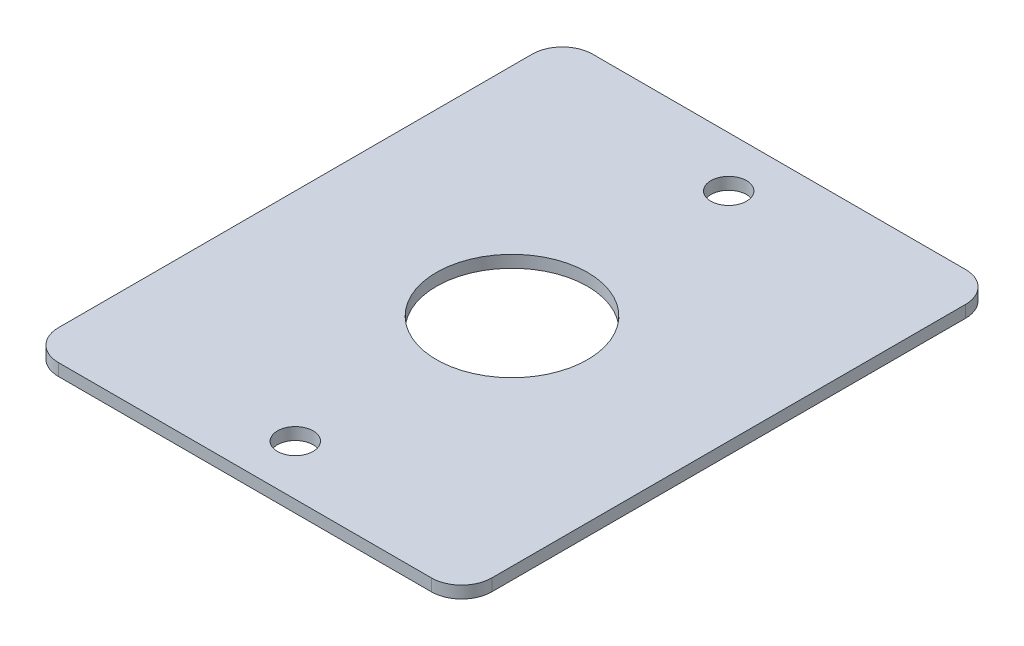
ISO-10303-21;
HEADER;
FILE_DESCRIPTION(('STEP AP214'),'2;1');
FILE_NAME('part.step','',(''),(''),'','','');
FILE_SCHEMA(('AUTOMOTIVE_DESIGN { 1 0 10303 214 1 1 1 1 }'));
ENDSEC;
DATA;
#1=APPLICATION_CONTEXT('core data for automotive mechanical design processes');
#2=APPLICATION_PROTOCOL_DEFINITION('international standard','automotive_design',2000,#1);
#3=PRODUCT_CONTEXT('',#1,'mechanical');
#4=PRODUCT('Part','Part','',(#3));
#5=PRODUCT_RELATED_PRODUCT_CATEGORY('part','',(#4));
#6=PRODUCT_DEFINITION_FORMATION('','',#4);
#7=PRODUCT_DEFINITION_CONTEXT('part definition',#1,'design');
#8=PRODUCT_DEFINITION('design','',#6,#7);
#9=PRODUCT_DEFINITION_SHAPE('','',#8);
#10=(LENGTH_UNIT() NAMED_UNIT(*) SI_UNIT(.MILLI.,.METRE.));
#11=(NAMED_UNIT(*) PLANE_ANGLE_UNIT() SI_UNIT($,.RADIAN.));
#12=(NAMED_UNIT(*) SI_UNIT($,.STERADIAN.) SOLID_ANGLE_UNIT());
#13=UNCERTAINTY_MEASURE_WITH_UNIT(LENGTH_MEASURE(1.E-05),#10,'distance_accuracy_value','');
#14=(GEOMETRIC_REPRESENTATION_CONTEXT(3) GLOBAL_UNCERTAINTY_ASSIGNED_CONTEXT((#13)) GLOBAL_UNIT_ASSIGNED_CONTEXT((#10,
#11,#12)) REPRESENTATION_CONTEXT('',''));
#15=CARTESIAN_POINT('',(0.,0.,0.));
#16=DIRECTION('',(0.,0.,1.));
#17=DIRECTION('',(1.,0.,0.));
#18=AXIS2_PLACEMENT_3D('',#15,#16,#17);
#19=CARTESIAN_POINT('',(0.,1.524,0.));
#20=DIRECTION('',(0.,-1.,0.));
#21=DIRECTION('',(0.,0.,-1.));
#22=AXIS2_PLACEMENT_3D('',#19,#20,#21);
#23=PLANE('',#22);
#24=DIRECTION('',(0.,0.,-1.));
#25=VECTOR('',#24,1.);
#26=CARTESIAN_POINT('',(27.305,1.524,-33.655));
#27=LINE('',#26,#25);
#28=CARTESIAN_POINT('',(27.305,1.524,29.845));
#29=VERTEX_POINT('',#28);
#30=CARTESIAN_POINT('',(27.305,1.524,-29.845));
#31=VERTEX_POINT('',#30);
#32=EDGE_CURVE('E140',#29,#31,#27,.T.);
#33=ORIENTED_EDGE('',*,*,#32,.T.);
#34=CARTESIAN_POINT('',(23.495,1.524,-29.845));
#35=DIRECTION('',(0.,-1.,0.));
#36=DIRECTION('',(0.,0.,-1.));
#37=AXIS2_PLACEMENT_3D('',#34,#35,#36);
#38=CIRCLE('',#37,3.81);
#39=CARTESIAN_POINT('',(23.495,1.524,-33.655));
#40=VERTEX_POINT('',#39);
#41=EDGE_CURVE('E158',#31,#40,#38,.F.);
#42=ORIENTED_EDGE('',*,*,#41,.T.);
#43=DIRECTION('',(-1.,0.,0.));
#44=VECTOR('',#43,1.);
#45=CARTESIAN_POINT('',(-27.305,1.524,-33.655));
#46=LINE('',#45,#44);
#47=CARTESIAN_POINT('',(-23.495,1.524,-33.655));
#48=VERTEX_POINT('',#47);
#49=EDGE_CURVE('E122',#40,#48,#46,.T.);
#50=ORIENTED_EDGE('',*,*,#49,.T.);
#51=CARTESIAN_POINT('',(-23.495,1.524,-29.845));
#52=DIRECTION('',(0.,-1.,0.));
#53=DIRECTION('',(0.,0.,-1.));
#54=AXIS2_PLACEMENT_3D('',#51,#52,#53);
#55=CIRCLE('',#54,3.81);
#56=CARTESIAN_POINT('',(-27.305,1.524,-29.845));
#57=VERTEX_POINT('',#56);
#58=EDGE_CURVE('E154',#48,#57,#55,.F.);
#59=ORIENTED_EDGE('',*,*,#58,.T.);
#60=DIRECTION('',(0.,0.,1.));
#61=VECTOR('',#60,1.);
#62=CARTESIAN_POINT('',(-27.305,1.524,-33.655));
#63=LINE('',#62,#61);
#64=CARTESIAN_POINT('',(-27.305,1.524,29.845));
#65=VERTEX_POINT('',#64);
#66=EDGE_CURVE('E167',#57,#65,#63,.T.);
#67=ORIENTED_EDGE('',*,*,#66,.T.);
#68=CARTESIAN_POINT('',(-23.495,1.524,29.845));
#69=DIRECTION('',(0.,-1.,0.));
#70=DIRECTION('',(0.,0.,-1.));
#71=AXIS2_PLACEMENT_3D('',#68,#69,#70);
#72=CIRCLE('',#71,3.81);
#73=CARTESIAN_POINT('',(-23.495,1.524,33.655));
#74=VERTEX_POINT('',#73);
#75=EDGE_CURVE('E57',#65,#74,#72,.F.);
#76=ORIENTED_EDGE('',*,*,#75,.T.);
#77=DIRECTION('',(1.,0.,0.));
#78=VECTOR('',#77,1.);
#79=CARTESIAN_POINT('',(-27.305,1.524,33.655));
#80=LINE('',#79,#78);
#81=CARTESIAN_POINT('',(23.495,1.524,33.655));
#82=VERTEX_POINT('',#81);
#83=EDGE_CURVE('E173',#74,#82,#80,.T.);
#84=ORIENTED_EDGE('',*,*,#83,.T.);
#85=CARTESIAN_POINT('',(23.495,1.524,29.845));
#86=DIRECTION('',(0.,-1.,0.));
#87=DIRECTION('',(0.,0.,-1.));
#88=AXIS2_PLACEMENT_3D('',#85,#86,#87);
#89=CIRCLE('',#88,3.81);
#90=EDGE_CURVE('E156',#82,#29,#89,.F.);
#91=ORIENTED_EDGE('',*,*,#90,.T.);
#92=EDGE_LOOP('',(#33,#42,#50,#59,#67,#76,#84,#91));
#93=FACE_BOUND('',#92,.T.);
#94=CARTESIAN_POINT('',(0.,1.524,0.));
#95=DIRECTION('',(0.,1.,0.));
#96=DIRECTION('',(0.,0.,1.));
#97=AXIS2_PLACEMENT_3D('',#94,#95,#96);
#98=CIRCLE('',#97,9.525);
#99=CARTESIAN_POINT('',(0.,1.524,-9.525));
#100=VERTEX_POINT('',#99);
#101=EDGE_CURVE('E131',#100,#100,#98,.T.);
#102=ORIENTED_EDGE('',*,*,#101,.F.);
#103=EDGE_LOOP('',(#102));
#104=FACE_BOUND('',#103,.T.);
#105=CARTESIAN_POINT('',(0.,1.524,-27.305));
#106=DIRECTION('',(0.,1.,0.));
#107=DIRECTION('',(0.,0.,1.));
#108=AXIS2_PLACEMENT_3D('',#105,#106,#107);
#109=CIRCLE('',#108,2.2479);
#110=CARTESIAN_POINT('',(0.,1.524,-29.5529));
#111=VERTEX_POINT('',#110);
#112=EDGE_CURVE('E188',#111,#111,#109,.T.);
#113=ORIENTED_EDGE('',*,*,#112,.F.);
#114=EDGE_LOOP('',(#113));
#115=FACE_BOUND('',#114,.T.);
#116=CARTESIAN_POINT('',(0.,1.524,27.305));
#117=DIRECTION('',(0.,1.,0.));
#118=DIRECTION('',(0.,0.,1.));
#119=AXIS2_PLACEMENT_3D('',#116,#117,#118);
#120=CIRCLE('',#119,2.2479);
#121=CARTESIAN_POINT('',(0.,1.524,25.0571));
#122=VERTEX_POINT('',#121);
#123=EDGE_CURVE('E193',#122,#122,#120,.T.);
#124=ORIENTED_EDGE('',*,*,#123,.F.);
#125=EDGE_LOOP('',(#124));
#126=FACE_BOUND('',#125,.T.);
#127=ADVANCED_FACE('F35',(#93,#104,#115,#126),#23,.F.);
#128=CARTESIAN_POINT('',(0.,0.,0.));
#129=DIRECTION('',(0.,-1.,0.));
#130=DIRECTION('',(0.,0.,-1.));
#131=AXIS2_PLACEMENT_3D('',#128,#129,#130);
#132=PLANE('',#131);
#133=CARTESIAN_POINT('',(0.,0.,-27.305));
#134=DIRECTION('',(0.,1.,0.));
#135=DIRECTION('',(0.,0.,1.));
#136=AXIS2_PLACEMENT_3D('',#133,#134,#135);
#137=CIRCLE('',#136,2.2479);
#138=CARTESIAN_POINT('',(0.,0.,-29.5529));
#139=VERTEX_POINT('',#138);
#140=EDGE_CURVE('E190',#139,#139,#137,.T.);
#141=ORIENTED_EDGE('',*,*,#140,.T.);
#142=EDGE_LOOP('',(#141));
#143=FACE_BOUND('',#142,.T.);
#144=DIRECTION('',(-1.,0.,0.));
#145=VECTOR('',#144,1.);
#146=CARTESIAN_POINT('',(-27.305,0.,-33.655));
#147=LINE('',#146,#145);
#148=CARTESIAN_POINT('',(23.495,0.,-33.655));
#149=VERTEX_POINT('',#148);
#150=CARTESIAN_POINT('',(-23.495,0.,-33.655));
#151=VERTEX_POINT('',#150);
#152=EDGE_CURVE('E119',#149,#151,#147,.T.);
#153=ORIENTED_EDGE('',*,*,#152,.F.);
#154=CARTESIAN_POINT('',(23.495,0.,-29.845));
#155=DIRECTION('',(0.,-1.,0.));
#156=DIRECTION('',(0.,0.,-1.));
#157=AXIS2_PLACEMENT_3D('',#154,#155,#156);
#158=CIRCLE('',#157,3.81);
#159=CARTESIAN_POINT('',(27.305,0.,-29.845));
#160=VERTEX_POINT('',#159);
#161=EDGE_CURVE('E102',#149,#160,#158,.T.);
#162=ORIENTED_EDGE('',*,*,#161,.T.);
#163=DIRECTION('',(0.,0.,-1.));
#164=VECTOR('',#163,1.);
#165=CARTESIAN_POINT('',(27.305,0.,-33.655));
#166=LINE('',#165,#164);
#167=CARTESIAN_POINT('',(27.305,0.,29.845));
#168=VERTEX_POINT('',#167);
#169=EDGE_CURVE('E144',#168,#160,#166,.T.);
#170=ORIENTED_EDGE('',*,*,#169,.F.);
#171=CARTESIAN_POINT('',(23.495,0.,29.845));
#172=DIRECTION('',(0.,-1.,0.));
#173=DIRECTION('',(0.,0.,-1.));
#174=AXIS2_PLACEMENT_3D('',#171,#172,#173);
#175=CIRCLE('',#174,3.81);
#176=CARTESIAN_POINT('',(23.495,0.,33.655));
#177=VERTEX_POINT('',#176);
#178=EDGE_CURVE('E113',#168,#177,#175,.T.);
#179=ORIENTED_EDGE('',*,*,#178,.T.);
#180=DIRECTION('',(1.,0.,0.));
#181=VECTOR('',#180,1.);
#182=CARTESIAN_POINT('',(-27.305,0.,33.655));
#183=LINE('',#182,#181);
#184=CARTESIAN_POINT('',(-23.495,0.,33.655));
#185=VERTEX_POINT('',#184);
#186=EDGE_CURVE('E134',#185,#177,#183,.T.);
#187=ORIENTED_EDGE('',*,*,#186,.F.);
#188=CARTESIAN_POINT('',(-23.495,0.,29.845));
#189=DIRECTION('',(0.,-1.,0.));
#190=DIRECTION('',(0.,0.,-1.));
#191=AXIS2_PLACEMENT_3D('',#188,#189,#190);
#192=CIRCLE('',#191,3.81);
#193=CARTESIAN_POINT('',(-27.305,0.,29.845));
#194=VERTEX_POINT('',#193);
#195=EDGE_CURVE('E123',#185,#194,#192,.T.);
#196=ORIENTED_EDGE('',*,*,#195,.T.);
#197=DIRECTION('',(0.,0.,1.));
#198=VECTOR('',#197,1.);
#199=CARTESIAN_POINT('',(-27.305,0.,-33.655));
#200=LINE('',#199,#198);
#201=CARTESIAN_POINT('',(-27.305,0.,-29.845));
#202=VERTEX_POINT('',#201);
#203=EDGE_CURVE('E130',#202,#194,#200,.T.);
#204=ORIENTED_EDGE('',*,*,#203,.F.);
#205=CARTESIAN_POINT('',(-23.495,0.,-29.845));
#206=DIRECTION('',(0.,-1.,0.));
#207=DIRECTION('',(0.,0.,-1.));
#208=AXIS2_PLACEMENT_3D('',#205,#206,#207);
#209=CIRCLE('',#208,3.81);
#210=EDGE_CURVE('E129',#202,#151,#209,.T.);
#211=ORIENTED_EDGE('',*,*,#210,.T.);
#212=EDGE_LOOP('',(#153,#162,#170,#179,#187,#196,#204,#211));
#213=FACE_BOUND('',#212,.T.);
#214=CARTESIAN_POINT('',(0.,0.,0.));
#215=DIRECTION('',(0.,1.,0.));
#216=DIRECTION('',(0.,0.,1.));
#217=AXIS2_PLACEMENT_3D('',#214,#215,#216);
#218=CIRCLE('',#217,9.525);
#219=CARTESIAN_POINT('',(0.,0.,-9.525));
#220=VERTEX_POINT('',#219);
#221=EDGE_CURVE('E137',#220,#220,#218,.T.);
#222=ORIENTED_EDGE('',*,*,#221,.T.);
#223=EDGE_LOOP('',(#222));
#224=FACE_BOUND('',#223,.T.);
#225=CARTESIAN_POINT('',(0.,0.,27.305));
#226=DIRECTION('',(0.,1.,0.));
#227=DIRECTION('',(0.,0.,1.));
#228=AXIS2_PLACEMENT_3D('',#225,#226,#227);
#229=CIRCLE('',#228,2.2479);
#230=CARTESIAN_POINT('',(0.,0.,25.0571));
#231=VERTEX_POINT('',#230);
#232=EDGE_CURVE('E196',#231,#231,#229,.T.);
#233=ORIENTED_EDGE('',*,*,#232,.T.);
#234=EDGE_LOOP('',(#233));
#235=FACE_BOUND('',#234,.T.);
#236=ADVANCED_FACE('F126',(#143,#213,#224,#235),#132,.T.);
#237=CARTESIAN_POINT('',(-27.305,1.524,-33.655));
#238=DIRECTION('',(0.,0.,1.));
#239=DIRECTION('',(1.,0.,0.));
#240=AXIS2_PLACEMENT_3D('',#237,#238,#239);
#241=PLANE('',#240);
#242=ORIENTED_EDGE('',*,*,#49,.F.);
#243=DIRECTION('',(0.,-1.,0.));
#244=VECTOR('',#243,1.);
#245=CARTESIAN_POINT('',(23.495,1.524,-33.655));
#246=LINE('',#245,#244);
#247=EDGE_CURVE('E106',#40,#149,#246,.T.);
#248=ORIENTED_EDGE('',*,*,#247,.T.);
#249=ORIENTED_EDGE('',*,*,#152,.T.);
#250=DIRECTION('',(0.,-1.,0.));
#251=VECTOR('',#250,1.);
#252=CARTESIAN_POINT('',(-23.495,1.524,-33.655));
#253=LINE('',#252,#251);
#254=EDGE_CURVE('E124',#151,#48,#253,.F.);
#255=ORIENTED_EDGE('',*,*,#254,.T.);
#256=EDGE_LOOP('',(#242,#248,#249,#255));
#257=FACE_BOUND('',#256,.T.);
#258=ADVANCED_FACE('F118',(#257),#241,.F.);
#259=CARTESIAN_POINT('',(-27.305,1.524,-33.655));
#260=DIRECTION('',(1.,0.,0.));
#261=DIRECTION('',(0.,0.,-1.));
#262=AXIS2_PLACEMENT_3D('',#259,#260,#261);
#263=PLANE('',#262);
#264=ORIENTED_EDGE('',*,*,#66,.F.);
#265=DIRECTION('',(0.,-1.,0.));
#266=VECTOR('',#265,1.);
#267=CARTESIAN_POINT('',(-27.305,1.524,-29.845));
#268=LINE('',#267,#266);
#269=EDGE_CURVE('E11',#57,#202,#268,.T.);
#270=ORIENTED_EDGE('',*,*,#269,.T.);
#271=ORIENTED_EDGE('',*,*,#203,.T.);
#272=DIRECTION('',(0.,-1.,0.));
#273=VECTOR('',#272,1.);
#274=CARTESIAN_POINT('',(-27.305,1.524,29.845));
#275=LINE('',#274,#273);
#276=EDGE_CURVE('E43',#194,#65,#275,.F.);
#277=ORIENTED_EDGE('',*,*,#276,.T.);
#278=EDGE_LOOP('',(#264,#270,#271,#277));
#279=FACE_BOUND('',#278,.T.);
#280=ADVANCED_FACE('F166',(#279),#263,.F.);
#281=CARTESIAN_POINT('',(-27.305,1.524,33.655));
#282=DIRECTION('',(0.,0.,-1.));
#283=DIRECTION('',(-1.,0.,0.));
#284=AXIS2_PLACEMENT_3D('',#281,#282,#283);
#285=PLANE('',#284);
#286=ORIENTED_EDGE('',*,*,#186,.T.);
#287=DIRECTION('',(0.,-1.,0.));
#288=VECTOR('',#287,1.);
#289=CARTESIAN_POINT('',(23.495,1.524,33.655));
#290=LINE('',#289,#288);
#291=EDGE_CURVE('E50',#177,#82,#290,.F.);
#292=ORIENTED_EDGE('',*,*,#291,.T.);
#293=ORIENTED_EDGE('',*,*,#83,.F.);
#294=DIRECTION('',(0.,-1.,0.));
#295=VECTOR('',#294,1.);
#296=CARTESIAN_POINT('',(-23.495,1.524,33.655));
#297=LINE('',#296,#295);
#298=EDGE_CURVE('E160',#74,#185,#297,.T.);
#299=ORIENTED_EDGE('',*,*,#298,.T.);
#300=EDGE_LOOP('',(#286,#292,#293,#299));
#301=FACE_BOUND('',#300,.T.);
#302=ADVANCED_FACE('F177',(#301),#285,.F.);
#303=CARTESIAN_POINT('',(27.305,1.524,-33.655));
#304=DIRECTION('',(-1.,0.,0.));
#305=DIRECTION('',(0.,0.,1.));
#306=AXIS2_PLACEMENT_3D('',#303,#304,#305);
#307=PLANE('',#306);
#308=ORIENTED_EDGE('',*,*,#169,.T.);
#309=DIRECTION('',(0.,-1.,0.));
#310=VECTOR('',#309,1.);
#311=CARTESIAN_POINT('',(27.305,1.524,-29.845));
#312=LINE('',#311,#310);
#313=EDGE_CURVE('E107',#160,#31,#312,.F.);
#314=ORIENTED_EDGE('',*,*,#313,.T.);
#315=ORIENTED_EDGE('',*,*,#32,.F.);
#316=DIRECTION('',(0.,-1.,0.));
#317=VECTOR('',#316,1.);
#318=CARTESIAN_POINT('',(27.305,1.524,29.845));
#319=LINE('',#318,#317);
#320=EDGE_CURVE('E112',#29,#168,#319,.T.);
#321=ORIENTED_EDGE('',*,*,#320,.T.);
#322=EDGE_LOOP('',(#308,#314,#315,#321));
#323=FACE_BOUND('',#322,.T.);
#324=ADVANCED_FACE('F184',(#323),#307,.F.);
#325=CARTESIAN_POINT('',(0.,1.524,0.));
#326=DIRECTION('',(0.,-1.,0.));
#327=DIRECTION('',(0.,0.,-1.));
#328=AXIS2_PLACEMENT_3D('',#325,#326,#327);
#329=CYLINDRICAL_SURFACE('',#328,9.525);
#330=CARTESIAN_POINT('',(0.,1.524,-9.525));
#331=CARTESIAN_POINT('',(0.,1.508125,-9.525));
#332=CARTESIAN_POINT('',(0.,1.49225,-9.525));
#333=CARTESIAN_POINT('',(0.,1.4605,-9.525));
#334=CARTESIAN_POINT('',(0.,1.444625,-9.525));
#335=CARTESIAN_POINT('',(0.,1.412875,-9.525));
#336=CARTESIAN_POINT('',(0.,1.397,-9.525));
#337=CARTESIAN_POINT('',(0.,1.36525,-9.525));
#338=CARTESIAN_POINT('',(0.,1.349375,-9.525));
#339=CARTESIAN_POINT('',(0.,1.317625,-9.525));
#340=CARTESIAN_POINT('',(0.,1.30175,-9.525));
#341=CARTESIAN_POINT('',(0.,1.27,-9.525));
#342=CARTESIAN_POINT('',(0.,1.254125,-9.525));
#343=CARTESIAN_POINT('',(0.,1.222375,-9.525));
#344=CARTESIAN_POINT('',(0.,1.2065,-9.525));
#345=CARTESIAN_POINT('',(0.,1.17475,-9.525));
#346=CARTESIAN_POINT('',(0.,1.158875,-9.525));
#347=CARTESIAN_POINT('',(0.,1.127125,-9.525));
#348=CARTESIAN_POINT('',(0.,1.11125,-9.525));
#349=CARTESIAN_POINT('',(0.,1.0795,-9.525));
#350=CARTESIAN_POINT('',(0.,1.063625,-9.525));
#351=CARTESIAN_POINT('',(0.,1.031875,-9.525));
#352=CARTESIAN_POINT('',(0.,1.016,-9.525));
#353=CARTESIAN_POINT('',(0.,0.98425,-9.525));
#354=CARTESIAN_POINT('',(0.,0.968375,-9.525));
#355=CARTESIAN_POINT('',(0.,0.936625,-9.525));
#356=CARTESIAN_POINT('',(0.,0.92075,-9.525));
#357=CARTESIAN_POINT('',(0.,0.889,-9.525));
#358=CARTESIAN_POINT('',(0.,0.873125,-9.525));
#359=CARTESIAN_POINT('',(0.,0.841375,-9.525));
#360=CARTESIAN_POINT('',(0.,0.8255,-9.525));
#361=CARTESIAN_POINT('',(0.,0.79375,-9.525));
#362=CARTESIAN_POINT('',(0.,0.777875,-9.525));
#363=CARTESIAN_POINT('',(0.,0.746125,-9.525));
#364=CARTESIAN_POINT('',(0.,0.73025,-9.525));
#365=CARTESIAN_POINT('',(0.,0.6985,-9.525));
#366=CARTESIAN_POINT('',(0.,0.682625,-9.525));
#367=CARTESIAN_POINT('',(0.,0.650875,-9.525));
#368=CARTESIAN_POINT('',(0.,0.635,-9.525));
#369=CARTESIAN_POINT('',(0.,0.60325,-9.525));
#370=CARTESIAN_POINT('',(0.,0.587375,-9.525));
#371=CARTESIAN_POINT('',(0.,0.555625,-9.525));
#372=CARTESIAN_POINT('',(0.,0.53975,-9.525));
#373=CARTESIAN_POINT('',(0.,0.508,-9.525));
#374=CARTESIAN_POINT('',(0.,0.492125,-9.525));
#375=CARTESIAN_POINT('',(0.,0.460375,-9.525));
#376=CARTESIAN_POINT('',(0.,0.4445,-9.525));
#377=CARTESIAN_POINT('',(0.,0.41275,-9.525));
#378=CARTESIAN_POINT('',(0.,0.396875,-9.525));
#379=CARTESIAN_POINT('',(0.,0.365125,-9.525));
#380=CARTESIAN_POINT('',(0.,0.34925,-9.525));
#381=CARTESIAN_POINT('',(0.,0.3175,-9.525));
#382=CARTESIAN_POINT('',(0.,0.301625,-9.525));
#383=CARTESIAN_POINT('',(0.,0.269875,-9.525));
#384=CARTESIAN_POINT('',(0.,0.254,-9.525));
#385=CARTESIAN_POINT('',(0.,0.22225,-9.525));
#386=CARTESIAN_POINT('',(0.,0.206375,-9.525));
#387=CARTESIAN_POINT('',(0.,0.174625,-9.525));
#388=CARTESIAN_POINT('',(0.,0.15875,-9.525));
#389=CARTESIAN_POINT('',(0.,0.127,-9.525));
#390=CARTESIAN_POINT('',(0.,0.111125,-9.525));
#391=CARTESIAN_POINT('',(0.,0.079375,-9.525));
#392=CARTESIAN_POINT('',(0.,0.0635,-9.525));
#393=CARTESIAN_POINT('',(0.,0.0317499999999999,-9.525));
#394=CARTESIAN_POINT('',(0.,0.015875,-9.525));
#395=CARTESIAN_POINT('',(0.,0.,-9.525));
#396=B_SPLINE_CURVE_WITH_KNOTS('',3,(#330,#331,#332,#333,#334,#335,#336,#337,#338,#339,#340,
#341,#342,#343,#344,#345,#346,#347,#348,#349,#350,#351,#352,#353,#354,#355,#356,#357,#358,#359,
#360,#361,#362,#363,#364,#365,#366,#367,#368,#369,#370,#371,#372,#373,#374,#375,#376,#377,#378,
#379,#380,#381,#382,#383,#384,#385,#386,#387,#388,#389,#390,#391,#392,#393,#394,#395),
.UNSPECIFIED.,.F.,.F.,(4,2,2,2,2,2,2,2,2,2,2,2,2,2,2,2,2,2,2,2,2,2,2,2,2,2,2,2,2,2,2,2,4),(0.,
0.0476250000000001,0.0952500000000001,0.142875,0.1905,0.238125,0.28575,0.333375,0.381,0.428625,
0.47625,0.523875,0.5715,0.619125,0.66675,0.714375,0.762,0.809625,0.85725,0.904875,0.9525,
1.000125,1.04775,1.095375,1.143,1.190625,1.23825,1.285875,1.3335,1.381125,1.42875,1.476375,
1.524),.UNSPECIFIED.);
#397=EDGE_CURVE('BSEAM213',#100,#220,#396,.T.);
#398=ORIENTED_EDGE('',*,*,#101,.T.);
#399=ORIENTED_EDGE('',*,*,#221,.F.);
#400=ORIENTED_EDGE('',*,*,#397,.T.);
#401=ORIENTED_EDGE('',*,*,#397,.F.);
#402=EDGE_LOOP('',(#398,#400,#399,#401));
#403=FACE_BOUND('',#402,.T.);
#404=ADVANCED_FACE('F213',(#403),#329,.F.);
#405=CARTESIAN_POINT('',(0.,1.524,-27.305));
#406=DIRECTION('',(0.,-1.,0.));
#407=DIRECTION('',(0.,0.,-1.));
#408=AXIS2_PLACEMENT_3D('',#405,#406,#407);
#409=CYLINDRICAL_SURFACE('',#408,2.2479);
#410=CARTESIAN_POINT('',(0.,1.524,-29.5529));
#411=CARTESIAN_POINT('',(0.,1.508125,-29.5529));
#412=CARTESIAN_POINT('',(0.,1.49225,-29.5529));
#413=CARTESIAN_POINT('',(0.,1.4605,-29.5529));
#414=CARTESIAN_POINT('',(0.,1.444625,-29.5529));
#415=CARTESIAN_POINT('',(0.,1.412875,-29.5529));
#416=CARTESIAN_POINT('',(0.,1.397,-29.5529));
#417=CARTESIAN_POINT('',(0.,1.36525,-29.5529));
#418=CARTESIAN_POINT('',(0.,1.349375,-29.5529));
#419=CARTESIAN_POINT('',(0.,1.317625,-29.5529));
#420=CARTESIAN_POINT('',(0.,1.30175,-29.5529));
#421=CARTESIAN_POINT('',(0.,1.27,-29.5529));
#422=CARTESIAN_POINT('',(0.,1.254125,-29.5529));
#423=CARTESIAN_POINT('',(0.,1.222375,-29.5529));
#424=CARTESIAN_POINT('',(0.,1.2065,-29.5529));
#425=CARTESIAN_POINT('',(0.,1.17475,-29.5529));
#426=CARTESIAN_POINT('',(0.,1.158875,-29.5529));
#427=CARTESIAN_POINT('',(0.,1.127125,-29.5529));
#428=CARTESIAN_POINT('',(0.,1.11125,-29.5529));
#429=CARTESIAN_POINT('',(0.,1.0795,-29.5529));
#430=CARTESIAN_POINT('',(0.,1.063625,-29.5529));
#431=CARTESIAN_POINT('',(0.,1.031875,-29.5529));
#432=CARTESIAN_POINT('',(0.,1.016,-29.5529));
#433=CARTESIAN_POINT('',(0.,0.98425,-29.5529));
#434=CARTESIAN_POINT('',(0.,0.968375,-29.5529));
#435=CARTESIAN_POINT('',(0.,0.936625,-29.5529));
#436=CARTESIAN_POINT('',(0.,0.92075,-29.5529));
#437=CARTESIAN_POINT('',(0.,0.889,-29.5529));
#438=CARTESIAN_POINT('',(0.,0.873125,-29.5529));
#439=CARTESIAN_POINT('',(0.,0.841375,-29.5529));
#440=CARTESIAN_POINT('',(0.,0.8255,-29.5529));
#441=CARTESIAN_POINT('',(0.,0.79375,-29.5529));
#442=CARTESIAN_POINT('',(0.,0.777875,-29.5529));
#443=CARTESIAN_POINT('',(0.,0.746125,-29.5529));
#444=CARTESIAN_POINT('',(0.,0.73025,-29.5529));
#445=CARTESIAN_POINT('',(0.,0.6985,-29.5529));
#446=CARTESIAN_POINT('',(0.,0.682625,-29.5529));
#447=CARTESIAN_POINT('',(0.,0.650875,-29.5529));
#448=CARTESIAN_POINT('',(0.,0.635,-29.5529));
#449=CARTESIAN_POINT('',(0.,0.60325,-29.5529));
#450=CARTESIAN_POINT('',(0.,0.587375,-29.5529));
#451=CARTESIAN_POINT('',(0.,0.555625,-29.5529));
#452=CARTESIAN_POINT('',(0.,0.53975,-29.5529));
#453=CARTESIAN_POINT('',(0.,0.508,-29.5529));
#454=CARTESIAN_POINT('',(0.,0.492125,-29.5529));
#455=CARTESIAN_POINT('',(0.,0.460375,-29.5529));
#456=CARTESIAN_POINT('',(0.,0.4445,-29.5529));
#457=CARTESIAN_POINT('',(0.,0.41275,-29.5529));
#458=CARTESIAN_POINT('',(0.,0.396875,-29.5529));
#459=CARTESIAN_POINT('',(0.,0.365125,-29.5529));
#460=CARTESIAN_POINT('',(0.,0.34925,-29.5529));
#461=CARTESIAN_POINT('',(0.,0.3175,-29.5529));
#462=CARTESIAN_POINT('',(0.,0.301625,-29.5529));
#463=CARTESIAN_POINT('',(0.,0.269875,-29.5529));
#464=CARTESIAN_POINT('',(0.,0.254,-29.5529));
#465=CARTESIAN_POINT('',(0.,0.22225,-29.5529));
#466=CARTESIAN_POINT('',(0.,0.206375,-29.5529));
#467=CARTESIAN_POINT('',(0.,0.174625,-29.5529));
#468=CARTESIAN_POINT('',(0.,0.15875,-29.5529));
#469=CARTESIAN_POINT('',(0.,0.127,-29.5529));
#470=CARTESIAN_POINT('',(0.,0.111125,-29.5529));
#471=CARTESIAN_POINT('',(0.,0.079375,-29.5529));
#472=CARTESIAN_POINT('',(0.,0.0635,-29.5529));
#473=CARTESIAN_POINT('',(0.,0.0317499999999999,-29.5529));
#474=CARTESIAN_POINT('',(0.,0.015875,-29.5529));
#475=CARTESIAN_POINT('',(0.,0.,-29.5529));
#476=B_SPLINE_CURVE_WITH_KNOTS('',3,(#410,#411,#412,#413,#414,#415,#416,#417,#418,#419,#420,
#421,#422,#423,#424,#425,#426,#427,#428,#429,#430,#431,#432,#433,#434,#435,#436,#437,#438,#439,
#440,#441,#442,#443,#444,#445,#446,#447,#448,#449,#450,#451,#452,#453,#454,#455,#456,#457,#458,
#459,#460,#461,#462,#463,#464,#465,#466,#467,#468,#469,#470,#471,#472,#473,#474,#475),
.UNSPECIFIED.,.F.,.F.,(4,2,2,2,2,2,2,2,2,2,2,2,2,2,2,2,2,2,2,2,2,2,2,2,2,2,2,2,2,2,2,2,4),(0.,
0.0476249999999999,0.0952499999999998,0.142875,0.1905,0.238125,0.28575,0.333375,0.381,0.428625,
0.47625,0.523875,0.5715,0.619125,0.66675,0.714375,0.762,0.809625,0.85725,0.904875,0.9525,
1.000125,1.04775,1.095375,1.143,1.190625,1.23825,1.285875,1.3335,1.381125,1.42875,1.476375,
1.524),.UNSPECIFIED.);
#477=EDGE_CURVE('BSEAM296',#111,#139,#476,.T.);
#478=ORIENTED_EDGE('',*,*,#112,.T.);
#479=ORIENTED_EDGE('',*,*,#140,.F.);
#480=ORIENTED_EDGE('',*,*,#477,.T.);
#481=ORIENTED_EDGE('',*,*,#477,.F.);
#482=EDGE_LOOP('',(#478,#480,#479,#481));
#483=FACE_BOUND('',#482,.T.);
#484=ADVANCED_FACE('F296',(#483),#409,.F.);
#485=CARTESIAN_POINT('',(0.,1.524,27.305));
#486=DIRECTION('',(0.,-1.,0.));
#487=DIRECTION('',(0.,0.,-1.));
#488=AXIS2_PLACEMENT_3D('',#485,#486,#487);
#489=CYLINDRICAL_SURFACE('',#488,2.2479);
#490=CARTESIAN_POINT('',(0.,1.524,25.0571));
#491=CARTESIAN_POINT('',(0.,1.508125,25.0571));
#492=CARTESIAN_POINT('',(0.,1.49225,25.0571));
#493=CARTESIAN_POINT('',(0.,1.4605,25.0571));
#494=CARTESIAN_POINT('',(0.,1.444625,25.0571));
#495=CARTESIAN_POINT('',(0.,1.412875,25.0571));
#496=CARTESIAN_POINT('',(0.,1.397,25.0571));
#497=CARTESIAN_POINT('',(0.,1.36525,25.0571));
#498=CARTESIAN_POINT('',(0.,1.349375,25.0571));
#499=CARTESIAN_POINT('',(0.,1.317625,25.0571));
#500=CARTESIAN_POINT('',(0.,1.30175,25.0571));
#501=CARTESIAN_POINT('',(0.,1.27,25.0571));
#502=CARTESIAN_POINT('',(0.,1.254125,25.0571));
#503=CARTESIAN_POINT('',(0.,1.222375,25.0571));
#504=CARTESIAN_POINT('',(0.,1.2065,25.0571));
#505=CARTESIAN_POINT('',(0.,1.17475,25.0571));
#506=CARTESIAN_POINT('',(0.,1.158875,25.0571));
#507=CARTESIAN_POINT('',(0.,1.127125,25.0571));
#508=CARTESIAN_POINT('',(0.,1.11125,25.0571));
#509=CARTESIAN_POINT('',(0.,1.0795,25.0571));
#510=CARTESIAN_POINT('',(0.,1.063625,25.0571));
#511=CARTESIAN_POINT('',(0.,1.031875,25.0571));
#512=CARTESIAN_POINT('',(0.,1.016,25.0571));
#513=CARTESIAN_POINT('',(0.,0.98425,25.0571));
#514=CARTESIAN_POINT('',(0.,0.968375,25.0571));
#515=CARTESIAN_POINT('',(0.,0.936625,25.0571));
#516=CARTESIAN_POINT('',(0.,0.92075,25.0571));
#517=CARTESIAN_POINT('',(0.,0.889,25.0571));
#518=CARTESIAN_POINT('',(0.,0.873125,25.0571));
#519=CARTESIAN_POINT('',(0.,0.841375,25.0571));
#520=CARTESIAN_POINT('',(0.,0.8255,25.0571));
#521=CARTESIAN_POINT('',(0.,0.79375,25.0571));
#522=CARTESIAN_POINT('',(0.,0.777875,25.0571));
#523=CARTESIAN_POINT('',(0.,0.746125,25.0571));
#524=CARTESIAN_POINT('',(0.,0.73025,25.0571));
#525=CARTESIAN_POINT('',(0.,0.6985,25.0571));
#526=CARTESIAN_POINT('',(0.,0.682625,25.0571));
#527=CARTESIAN_POINT('',(0.,0.650875,25.0571));
#528=CARTESIAN_POINT('',(0.,0.635,25.0571));
#529=CARTESIAN_POINT('',(0.,0.60325,25.0571));
#530=CARTESIAN_POINT('',(0.,0.587375,25.0571));
#531=CARTESIAN_POINT('',(0.,0.555625,25.0571));
#532=CARTESIAN_POINT('',(0.,0.53975,25.0571));
#533=CARTESIAN_POINT('',(0.,0.508,25.0571));
#534=CARTESIAN_POINT('',(0.,0.492125,25.0571));
#535=CARTESIAN_POINT('',(0.,0.460375,25.0571));
#536=CARTESIAN_POINT('',(0.,0.4445,25.0571));
#537=CARTESIAN_POINT('',(0.,0.41275,25.0571));
#538=CARTESIAN_POINT('',(0.,0.396875,25.0571));
#539=CARTESIAN_POINT('',(0.,0.365125,25.0571));
#540=CARTESIAN_POINT('',(0.,0.34925,25.0571));
#541=CARTESIAN_POINT('',(0.,0.3175,25.0571));
#542=CARTESIAN_POINT('',(0.,0.301625,25.0571));
#543=CARTESIAN_POINT('',(0.,0.269875,25.0571));
#544=CARTESIAN_POINT('',(0.,0.254,25.0571));
#545=CARTESIAN_POINT('',(0.,0.22225,25.0571));
#546=CARTESIAN_POINT('',(0.,0.206375,25.0571));
#547=CARTESIAN_POINT('',(0.,0.174625,25.0571));
#548=CARTESIAN_POINT('',(0.,0.15875,25.0571));
#549=CARTESIAN_POINT('',(0.,0.127,25.0571));
#550=CARTESIAN_POINT('',(0.,0.111125,25.0571));
#551=CARTESIAN_POINT('',(0.,0.079375,25.0571));
#552=CARTESIAN_POINT('',(0.,0.0635,25.0571));
#553=CARTESIAN_POINT('',(0.,0.0317499999999999,25.0571));
#554=CARTESIAN_POINT('',(0.,0.015875,25.0571));
#555=CARTESIAN_POINT('',(0.,0.,25.0571));
#556=B_SPLINE_CURVE_WITH_KNOTS('',3,(#490,#491,#492,#493,#494,#495,#496,#497,#498,#499,#500,
#501,#502,#503,#504,#505,#506,#507,#508,#509,#510,#511,#512,#513,#514,#515,#516,#517,#518,#519,
#520,#521,#522,#523,#524,#525,#526,#527,#528,#529,#530,#531,#532,#533,#534,#535,#536,#537,#538,
#539,#540,#541,#542,#543,#544,#545,#546,#547,#548,#549,#550,#551,#552,#553,#554,#555),
.UNSPECIFIED.,.F.,.F.,(4,2,2,2,2,2,2,2,2,2,2,2,2,2,2,2,2,2,2,2,2,2,2,2,2,2,2,2,2,2,2,2,4),(0.,
0.0476249999999999,0.0952499999999998,0.142875,0.1905,0.238125,0.28575,0.333375,0.381,0.428625,
0.47625,0.523875,0.5715,0.619125,0.66675,0.714375,0.762,0.809625,0.85725,0.904875,0.9525,
1.000125,1.04775,1.095375,1.143,1.190625,1.23825,1.285875,1.3335,1.381125,1.42875,1.476375,
1.524),.UNSPECIFIED.);
#557=EDGE_CURVE('BSEAM202',#122,#231,#556,.T.);
#558=ORIENTED_EDGE('',*,*,#123,.T.);
#559=ORIENTED_EDGE('',*,*,#232,.F.);
#560=ORIENTED_EDGE('',*,*,#557,.T.);
#561=ORIENTED_EDGE('',*,*,#557,.F.);
#562=EDGE_LOOP('',(#558,#560,#559,#561));
#563=FACE_BOUND('',#562,.T.);
#564=ADVANCED_FACE('F202',(#563),#489,.F.);
#565=CARTESIAN_POINT('',(23.495,1.524,-29.845));
#566=DIRECTION('',(0.,-1.,0.));
#567=DIRECTION('',(0.,0.,-1.));
#568=AXIS2_PLACEMENT_3D('',#565,#566,#567);
#569=CYLINDRICAL_SURFACE('',#568,3.81);
#570=ORIENTED_EDGE('',*,*,#41,.F.);
#571=ORIENTED_EDGE('',*,*,#313,.F.);
#572=ORIENTED_EDGE('',*,*,#161,.F.);
#573=ORIENTED_EDGE('',*,*,#247,.F.);
#574=EDGE_LOOP('',(#570,#571,#572,#573));
#575=FACE_BOUND('',#574,.T.);
#576=ADVANCED_FACE('F105',(#575),#569,.T.);
#577=CARTESIAN_POINT('',(23.495,1.524,29.845));
#578=DIRECTION('',(0.,-1.,0.));
#579=DIRECTION('',(0.,0.,-1.));
#580=AXIS2_PLACEMENT_3D('',#577,#578,#579);
#581=CYLINDRICAL_SURFACE('',#580,3.81);
#582=ORIENTED_EDGE('',*,*,#90,.F.);
#583=ORIENTED_EDGE('',*,*,#291,.F.);
#584=ORIENTED_EDGE('',*,*,#178,.F.);
#585=ORIENTED_EDGE('',*,*,#320,.F.);
#586=EDGE_LOOP('',(#582,#583,#584,#585));
#587=FACE_BOUND('',#586,.T.);
#588=ADVANCED_FACE('F181',(#587),#581,.T.);
#589=CARTESIAN_POINT('',(-23.495,1.524,-29.845));
#590=DIRECTION('',(0.,-1.,0.));
#591=DIRECTION('',(0.,0.,-1.));
#592=AXIS2_PLACEMENT_3D('',#589,#590,#591);
#593=CYLINDRICAL_SURFACE('',#592,3.81);
#594=ORIENTED_EDGE('',*,*,#58,.F.);
#595=ORIENTED_EDGE('',*,*,#254,.F.);
#596=ORIENTED_EDGE('',*,*,#210,.F.);
#597=ORIENTED_EDGE('',*,*,#269,.F.);
#598=EDGE_LOOP('',(#594,#595,#596,#597));
#599=FACE_BOUND('',#598,.T.);
#600=ADVANCED_FACE('F227',(#599),#593,.T.);
#601=CARTESIAN_POINT('',(-23.495,1.524,29.845));
#602=DIRECTION('',(0.,-1.,0.));
#603=DIRECTION('',(0.,0.,-1.));
#604=AXIS2_PLACEMENT_3D('',#601,#602,#603);
#605=CYLINDRICAL_SURFACE('',#604,3.81);
#606=ORIENTED_EDGE('',*,*,#75,.F.);
#607=ORIENTED_EDGE('',*,*,#276,.F.);
#608=ORIENTED_EDGE('',*,*,#195,.F.);
#609=ORIENTED_EDGE('',*,*,#298,.F.);
#610=EDGE_LOOP('',(#606,#607,#608,#609));
#611=FACE_BOUND('',#610,.T.);
#612=ADVANCED_FACE('F37',(#611),#605,.T.);
#613=CLOSED_SHELL('',(#127,#236,#258,#280,#302,#324,#404,#484,#564,#576,#588,#600,#612));
#614=MANIFOLD_SOLID_BREP('B2',#613);
#615=ADVANCED_BREP_SHAPE_REPRESENTATION('',(#18,#614),#14);
#616=SHAPE_DEFINITION_REPRESENTATION(#9,#615);
ENDSEC;
END-ISO-10303-21;
